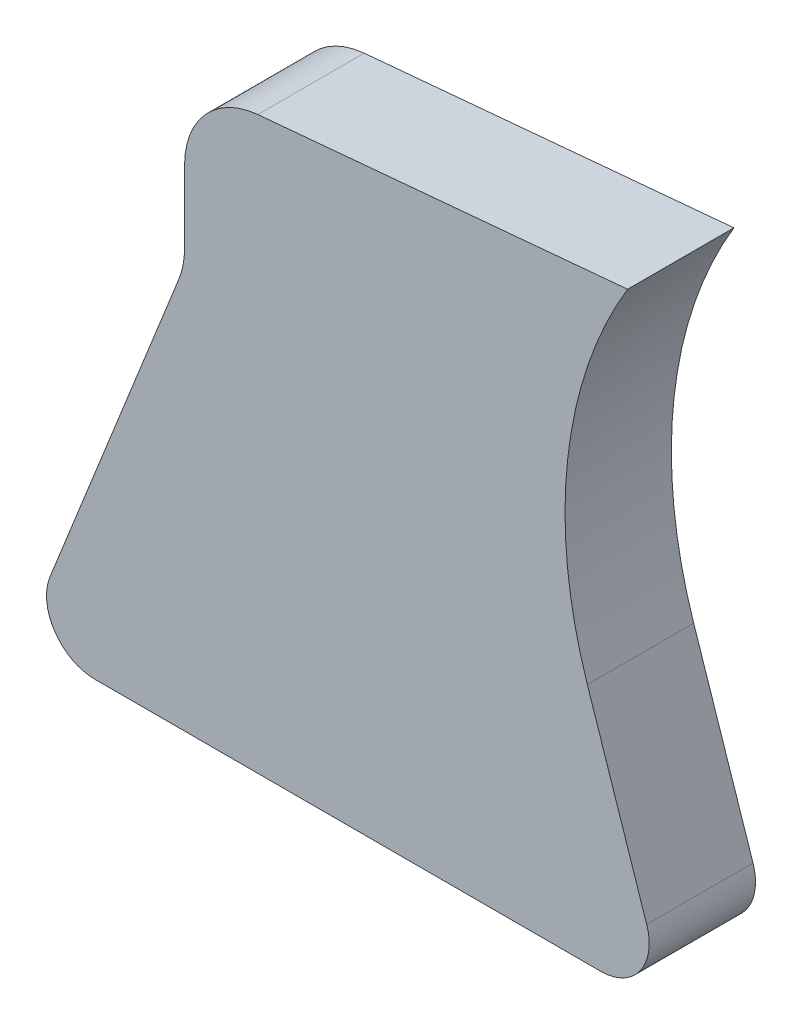
ISO-10303-21;
HEADER;
FILE_DESCRIPTION(('STEP AP214'),'2;1');
FILE_NAME('part.step','',(''),(''),'','','');
FILE_SCHEMA(('AUTOMOTIVE_DESIGN { 1 0 10303 214 1 1 1 1 }'));
ENDSEC;
DATA;
#1=APPLICATION_CONTEXT('core data for automotive mechanical design processes');
#2=APPLICATION_PROTOCOL_DEFINITION('international standard','automotive_design',2000,#1);
#3=PRODUCT_CONTEXT('',#1,'mechanical');
#4=PRODUCT('Part','Part','',(#3));
#5=PRODUCT_RELATED_PRODUCT_CATEGORY('part','',(#4));
#6=PRODUCT_DEFINITION_FORMATION('','',#4);
#7=PRODUCT_DEFINITION_CONTEXT('part definition',#1,'design');
#8=PRODUCT_DEFINITION('design','',#6,#7);
#9=PRODUCT_DEFINITION_SHAPE('','',#8);
#10=(LENGTH_UNIT() NAMED_UNIT(*) SI_UNIT(.MILLI.,.METRE.));
#11=(NAMED_UNIT(*) PLANE_ANGLE_UNIT() SI_UNIT($,.RADIAN.));
#12=(NAMED_UNIT(*) SI_UNIT($,.STERADIAN.) SOLID_ANGLE_UNIT());
#13=UNCERTAINTY_MEASURE_WITH_UNIT(LENGTH_MEASURE(1.E-05),#10,'distance_accuracy_value','');
#14=(GEOMETRIC_REPRESENTATION_CONTEXT(3) GLOBAL_UNCERTAINTY_ASSIGNED_CONTEXT((#13)) GLOBAL_UNIT_ASSIGNED_CONTEXT((#10,
#11,#12)) REPRESENTATION_CONTEXT('',''));
#15=CARTESIAN_POINT('',(0.,0.,0.));
#16=DIRECTION('',(0.,0.,1.));
#17=DIRECTION('',(1.,0.,0.));
#18=AXIS2_PLACEMENT_3D('',#15,#16,#17);
#19=CARTESIAN_POINT('',(50.8,0.,8.382));
#20=DIRECTION('',(0.,1.,0.));
#21=DIRECTION('',(-1.,0.,0.));
#22=AXIS2_PLACEMENT_3D('',#19,#20,#21);
#23=PLANE('',#22);
#24=DIRECTION('',(1.,0.,0.));
#25=VECTOR('',#24,1.);
#26=CARTESIAN_POINT('',(50.8,0.,0.));
#27=LINE('',#26,#25);
#28=CARTESIAN_POINT('',(5.6274955830365,0.,0.));
#29=VERTEX_POINT('',#28);
#30=CARTESIAN_POINT('',(45.5139073715862,0.,0.));
#31=VERTEX_POINT('',#30);
#32=EDGE_CURVE('E147',#29,#31,#27,.T.);
#33=ORIENTED_EDGE('',*,*,#32,.T.);
#34=DIRECTION('',(0.,0.,-1.));
#35=VECTOR('',#34,1.);
#36=CARTESIAN_POINT('',(45.5139073715862,0.,8.382));
#37=LINE('',#36,#35);
#38=CARTESIAN_POINT('',(45.5139073715862,0.,8.382));
#39=VERTEX_POINT('',#38);
#40=EDGE_CURVE('E54',#31,#39,#37,.F.);
#41=ORIENTED_EDGE('',*,*,#40,.T.);
#42=DIRECTION('',(1.,0.,0.));
#43=VECTOR('',#42,1.);
#44=CARTESIAN_POINT('',(50.8,0.,8.382));
#45=LINE('',#44,#43);
#46=CARTESIAN_POINT('',(5.6274955830365,0.,8.382));
#47=VERTEX_POINT('',#46);
#48=EDGE_CURVE('E122',#47,#39,#45,.T.);
#49=ORIENTED_EDGE('',*,*,#48,.F.);
#50=DIRECTION('',(0.,0.,-1.));
#51=VECTOR('',#50,1.);
#52=CARTESIAN_POINT('',(5.6274955830365,0.,8.382));
#53=LINE('',#52,#51);
#54=EDGE_CURVE('E184',#47,#29,#53,.T.);
#55=ORIENTED_EDGE('',*,*,#54,.T.);
#56=EDGE_LOOP('',(#33,#41,#49,#55));
#57=FACE_BOUND('',#56,.T.);
#58=ADVANCED_FACE('F33',(#57),#23,.F.);
#59=CARTESIAN_POINT('',(44.45,19.05,8.382));
#60=DIRECTION('',(-0.948683298050514,-0.316227766016838,0.));
#61=DIRECTION('',(0.316227766016838,-0.948683298050514,0.));
#62=AXIS2_PLACEMENT_3D('',#59,#60,#61);
#63=PLANE('',#62);
#64=DIRECTION('',(-0.316227766016838,0.948683298050514,0.));
#65=VECTOR('',#64,1.);
#66=CARTESIAN_POINT('',(44.45,19.05,8.382));
#67=LINE('',#66,#65);
#68=CARTESIAN_POINT('',(49.1283907371586,5.01482778852415,8.382));
#69=VERTEX_POINT('',#68);
#70=CARTESIAN_POINT('',(44.45,19.05,8.382));
#71=VERTEX_POINT('',#70);
#72=EDGE_CURVE('E111',#69,#71,#67,.T.);
#73=ORIENTED_EDGE('',*,*,#72,.F.);
#74=DIRECTION('',(0.,0.,-1.));
#75=VECTOR('',#74,1.);
#76=CARTESIAN_POINT('',(49.1283907371586,5.01482778852415,8.382));
#77=LINE('',#76,#75);
#78=CARTESIAN_POINT('',(49.1283907371586,5.01482778852415,0.));
#79=VERTEX_POINT('',#78);
#80=EDGE_CURVE('E178',#69,#79,#77,.T.);
#81=ORIENTED_EDGE('',*,*,#80,.T.);
#82=DIRECTION('',(-0.316227766016838,0.948683298050514,0.));
#83=VECTOR('',#82,1.);
#84=CARTESIAN_POINT('',(44.45,19.05,0.));
#85=LINE('',#84,#83);
#86=CARTESIAN_POINT('',(44.45,19.05,0.));
#87=VERTEX_POINT('',#86);
#88=EDGE_CURVE('E128',#79,#87,#85,.T.);
#89=ORIENTED_EDGE('',*,*,#88,.T.);
#90=DIRECTION('',(0.,0.,-1.));
#91=VECTOR('',#90,1.);
#92=CARTESIAN_POINT('',(44.45,19.05,8.382));
#93=LINE('',#92,#91);
#94=EDGE_CURVE('E125',#71,#87,#93,.T.);
#95=ORIENTED_EDGE('',*,*,#94,.F.);
#96=EDGE_LOOP('',(#73,#81,#89,#95));
#97=FACE_BOUND('',#96,.T.);
#98=ADVANCED_FACE('F126',(#97),#63,.F.);
#99=CARTESIAN_POINT('',(76.99375,29.8979166666667,8.382));
#100=DIRECTION('',(0.,0.,-1.));
#101=DIRECTION('',(-1.,0.,0.));
#102=AXIS2_PLACEMENT_3D('',#99,#100,#101);
#103=CYLINDRICAL_SURFACE('',#102,34.3041245343682);
#104=CARTESIAN_POINT('',(76.99375,29.8979166666667,0.));
#105=DIRECTION('',(0.,0.,-1.));
#106=DIRECTION('',(1.,0.,0.));
#107=AXIS2_PLACEMENT_3D('',#104,#105,#106);
#108=CIRCLE('',#107,34.3041245343682);
#109=CARTESIAN_POINT('',(47.625,47.625,0.));
#110=VERTEX_POINT('',#109);
#111=EDGE_CURVE('E150',#87,#110,#108,.T.);
#112=ORIENTED_EDGE('',*,*,#111,.T.);
#113=DIRECTION('',(0.,0.,-1.));
#114=VECTOR('',#113,1.);
#115=CARTESIAN_POINT('',(47.625,47.625,8.382));
#116=LINE('',#115,#114);
#117=CARTESIAN_POINT('',(47.625,47.625,8.382));
#118=VERTEX_POINT('',#117);
#119=EDGE_CURVE('E132',#118,#110,#116,.T.);
#120=ORIENTED_EDGE('',*,*,#119,.F.);
#121=CARTESIAN_POINT('',(76.99375,29.8979166666667,8.382));
#122=DIRECTION('',(0.,0.,-1.));
#123=DIRECTION('',(1.,0.,0.));
#124=AXIS2_PLACEMENT_3D('',#121,#122,#123);
#125=CIRCLE('',#124,34.3041245343682);
#126=EDGE_CURVE('E116',#71,#118,#125,.T.);
#127=ORIENTED_EDGE('',*,*,#126,.F.);
#128=ORIENTED_EDGE('',*,*,#94,.T.);
#129=EDGE_LOOP('',(#112,#120,#127,#128));
#130=FACE_BOUND('',#129,.T.);
#131=ADVANCED_FACE('F134',(#130),#103,.F.);
#132=CARTESIAN_POINT('',(12.7,44.45,8.382));
#133=DIRECTION('',(0.0905357460425185,-0.995893206467704,0.));
#134=DIRECTION('',(0.995893206467704,0.0905357460425185,0.));
#135=AXIS2_PLACEMENT_3D('',#132,#133,#134);
#136=PLANE('',#135);
#137=DIRECTION('',(-0.995893206467704,-0.0905357460425185,0.));
#138=VECTOR('',#137,1.);
#139=CARTESIAN_POINT('',(12.7,44.45,0.));
#140=LINE('',#139,#138);
#141=CARTESIAN_POINT('',(18.47509801263,44.9750089102391,0.));
#142=VERTEX_POINT('',#141);
#143=EDGE_CURVE('E152',#110,#142,#140,.T.);
#144=ORIENTED_EDGE('',*,*,#143,.T.);
#145=DIRECTION('',(0.,0.,-1.));
#146=VECTOR('',#145,1.);
#147=CARTESIAN_POINT('',(18.47509801263,44.9750089102391,8.382));
#148=LINE('',#147,#146);
#149=CARTESIAN_POINT('',(18.47509801263,44.9750089102391,8.382));
#150=VERTEX_POINT('',#149);
#151=EDGE_CURVE('E167',#142,#150,#148,.F.);
#152=ORIENTED_EDGE('',*,*,#151,.T.);
#153=DIRECTION('',(-0.995893206467704,-0.0905357460425185,0.));
#154=VECTOR('',#153,1.);
#155=CARTESIAN_POINT('',(12.7,44.45,8.382));
#156=LINE('',#155,#154);
#157=EDGE_CURVE('E137',#118,#150,#156,.T.);
#158=ORIENTED_EDGE('',*,*,#157,.F.);
#159=ORIENTED_EDGE('',*,*,#119,.T.);
#160=EDGE_LOOP('',(#144,#152,#158,#159));
#161=FACE_BOUND('',#160,.T.);
#162=ADVANCED_FACE('F213',(#161),#136,.F.);
#163=CARTESIAN_POINT('',(12.7,31.75,8.382));
#164=DIRECTION('',(1.,0.,0.));
#165=DIRECTION('',(0.,0.,-1.));
#166=AXIS2_PLACEMENT_3D('',#163,#164,#165);
#167=PLANE('',#166);
#168=DIRECTION('',(0.,-1.,0.));
#169=VECTOR('',#168,1.);
#170=CARTESIAN_POINT('',(12.7,31.75,8.382));
#171=LINE('',#170,#169);
#172=CARTESIAN_POINT('',(12.7,38.6510870491692,8.382));
#173=VERTEX_POINT('',#172);
#174=CARTESIAN_POINT('',(12.7,32.9728982626521,8.382));
#175=VERTEX_POINT('',#174);
#176=EDGE_CURVE('E139',#173,#175,#171,.T.);
#177=ORIENTED_EDGE('',*,*,#176,.F.);
#178=DIRECTION('',(0.,0.,-1.));
#179=VECTOR('',#178,1.);
#180=CARTESIAN_POINT('',(12.7,38.6510870491692,8.382));
#181=LINE('',#180,#179);
#182=CARTESIAN_POINT('',(12.7,38.6510870491692,0.));
#183=VERTEX_POINT('',#182);
#184=EDGE_CURVE('E162',#173,#183,#181,.T.);
#185=ORIENTED_EDGE('',*,*,#184,.T.);
#186=DIRECTION('',(0.,-1.,0.));
#187=VECTOR('',#186,1.);
#188=CARTESIAN_POINT('',(12.7,31.75,0.));
#189=LINE('',#188,#187);
#190=CARTESIAN_POINT('',(12.7,32.9728982626521,0.));
#191=VERTEX_POINT('',#190);
#192=EDGE_CURVE('E155',#183,#191,#189,.T.);
#193=ORIENTED_EDGE('',*,*,#192,.T.);
#194=DIRECTION('',(0.,0.,-1.));
#195=VECTOR('',#194,1.);
#196=CARTESIAN_POINT('',(12.7,32.9728982626521,8.382));
#197=LINE('',#196,#195);
#198=EDGE_CURVE('E131',#191,#175,#197,.F.);
#199=ORIENTED_EDGE('',*,*,#198,.T.);
#200=EDGE_LOOP('',(#177,#185,#193,#199));
#201=FACE_BOUND('',#200,.T.);
#202=ADVANCED_FACE('F205',(#201),#167,.F.);
#203=CARTESIAN_POINT('',(0.,0.,8.382));
#204=DIRECTION('',(0.928476690885259,-0.371390676354104,0.));
#205=DIRECTION('',(0.371390676354104,0.92847669088526,0.));
#206=AXIS2_PLACEMENT_3D('',#203,#204,#205);
#207=PLANE('',#206);
#208=DIRECTION('',(-0.371390676354104,-0.928476690885259,0.));
#209=VECTOR('',#208,1.);
#210=CARTESIAN_POINT('',(0.,0.,0.));
#211=LINE('',#210,#209);
#212=CARTESIAN_POINT('',(12.2458269871214,30.6145674678035,0.));
#213=VERTEX_POINT('',#212);
#214=CARTESIAN_POINT('',(2.08999939076365,5.22499847690914,0.));
#215=VERTEX_POINT('',#214);
#216=EDGE_CURVE('E158',#213,#215,#211,.T.);
#217=ORIENTED_EDGE('',*,*,#216,.T.);
#218=DIRECTION('',(0.,0.,-1.));
#219=VECTOR('',#218,1.);
#220=CARTESIAN_POINT('',(2.08999939076365,5.22499847690914,8.382));
#221=LINE('',#220,#219);
#222=CARTESIAN_POINT('',(2.08999939076365,5.22499847690914,8.382));
#223=VERTEX_POINT('',#222);
#224=EDGE_CURVE('E11',#215,#223,#221,.F.);
#225=ORIENTED_EDGE('',*,*,#224,.T.);
#226=DIRECTION('',(-0.371390676354104,-0.928476690885259,0.));
#227=VECTOR('',#226,1.);
#228=CARTESIAN_POINT('',(0.,0.,8.382));
#229=LINE('',#228,#227);
#230=CARTESIAN_POINT('',(12.2458269871214,30.6145674678035,8.382));
#231=VERTEX_POINT('',#230);
#232=EDGE_CURVE('E145',#231,#223,#229,.T.);
#233=ORIENTED_EDGE('',*,*,#232,.F.);
#234=DIRECTION('',(0.,0.,-1.));
#235=VECTOR('',#234,1.);
#236=CARTESIAN_POINT('',(12.2458269871214,30.6145674678035,0.));
#237=LINE('',#236,#235);
#238=EDGE_CURVE('E171',#231,#213,#237,.T.);
#239=ORIENTED_EDGE('',*,*,#238,.T.);
#240=EDGE_LOOP('',(#217,#225,#233,#239));
#241=FACE_BOUND('',#240,.T.);
#242=ADVANCED_FACE('F196',(#241),#207,.F.);
#243=CARTESIAN_POINT('',(76.99375,29.8979166666667,8.382));
#244=DIRECTION('',(0.,0.,1.));
#245=DIRECTION('',(1.,0.,0.));
#246=AXIS2_PLACEMENT_3D('',#243,#244,#245);
#247=PLANE('',#246);
#248=ORIENTED_EDGE('',*,*,#48,.T.);
#249=CARTESIAN_POINT('',(45.5139073715862,3.81,8.382));
#250=DIRECTION('',(0.,0.,1.));
#251=DIRECTION('',(1.,0.,0.));
#252=AXIS2_PLACEMENT_3D('',#249,#250,#251);
#253=CIRCLE('',#252,3.81);
#254=EDGE_CURVE('E41',#39,#69,#253,.T.);
#255=ORIENTED_EDGE('',*,*,#254,.T.);
#256=ORIENTED_EDGE('',*,*,#72,.T.);
#257=ORIENTED_EDGE('',*,*,#126,.T.);
#258=ORIENTED_EDGE('',*,*,#157,.T.);
#259=CARTESIAN_POINT('',(19.05,38.6510870491692,8.382));
#260=DIRECTION('',(0.,0.,1.));
#261=DIRECTION('',(1.,0.,0.));
#262=AXIS2_PLACEMENT_3D('',#259,#260,#261);
#263=CIRCLE('',#262,6.35);
#264=EDGE_CURVE('E169',#150,#173,#263,.T.);
#265=ORIENTED_EDGE('',*,*,#264,.T.);
#266=ORIENTED_EDGE('',*,*,#176,.T.);
#267=CARTESIAN_POINT('',(6.35,32.9728982626521,8.382));
#268=DIRECTION('',(0.,0.,1.));
#269=DIRECTION('',(1.,0.,0.));
#270=AXIS2_PLACEMENT_3D('',#267,#268,#269);
#271=CIRCLE('',#270,6.35);
#272=EDGE_CURVE('E176',#175,#231,#271,.F.);
#273=ORIENTED_EDGE('',*,*,#272,.T.);
#274=ORIENTED_EDGE('',*,*,#232,.T.);
#275=CARTESIAN_POINT('',(5.6274955830365,3.81,8.382));
#276=DIRECTION('',(0.,0.,1.));
#277=DIRECTION('',(1.,0.,0.));
#278=AXIS2_PLACEMENT_3D('',#275,#276,#277);
#279=CIRCLE('',#278,3.81);
#280=EDGE_CURVE('E188',#223,#47,#279,.T.);
#281=ORIENTED_EDGE('',*,*,#280,.T.);
#282=EDGE_LOOP('',(#248,#255,#256,#257,#258,#265,#266,#273,#274,#281));
#283=FACE_BOUND('',#282,.T.);
#284=ADVANCED_FACE('F113',(#283),#247,.T.);
#285=CARTESIAN_POINT('',(76.99375,29.8979166666667,0.));
#286=DIRECTION('',(0.,0.,1.));
#287=DIRECTION('',(1.,0.,0.));
#288=AXIS2_PLACEMENT_3D('',#285,#286,#287);
#289=PLANE('',#288);
#290=ORIENTED_EDGE('',*,*,#88,.F.);
#291=CARTESIAN_POINT('',(45.5139073715862,3.81,0.));
#292=DIRECTION('',(0.,0.,1.));
#293=DIRECTION('',(1.,0.,0.));
#294=AXIS2_PLACEMENT_3D('',#291,#292,#293);
#295=CIRCLE('',#294,3.81);
#296=EDGE_CURVE('E182',#79,#31,#295,.F.);
#297=ORIENTED_EDGE('',*,*,#296,.T.);
#298=ORIENTED_EDGE('',*,*,#32,.F.);
#299=CARTESIAN_POINT('',(5.6274955830365,3.81,0.));
#300=DIRECTION('',(0.,0.,1.));
#301=DIRECTION('',(1.,0.,0.));
#302=AXIS2_PLACEMENT_3D('',#299,#300,#301);
#303=CIRCLE('',#302,3.81);
#304=EDGE_CURVE('E180',#29,#215,#303,.F.);
#305=ORIENTED_EDGE('',*,*,#304,.T.);
#306=ORIENTED_EDGE('',*,*,#216,.F.);
#307=CARTESIAN_POINT('',(6.35,32.9728982626521,0.));
#308=DIRECTION('',(0.,0.,1.));
#309=DIRECTION('',(1.,0.,0.));
#310=AXIS2_PLACEMENT_3D('',#307,#308,#309);
#311=CIRCLE('',#310,6.35);
#312=EDGE_CURVE('E174',#213,#191,#311,.T.);
#313=ORIENTED_EDGE('',*,*,#312,.T.);
#314=ORIENTED_EDGE('',*,*,#192,.F.);
#315=CARTESIAN_POINT('',(19.05,38.6510870491692,0.));
#316=DIRECTION('',(0.,0.,1.));
#317=DIRECTION('',(1.,0.,0.));
#318=AXIS2_PLACEMENT_3D('',#315,#316,#317);
#319=CIRCLE('',#318,6.35);
#320=EDGE_CURVE('E165',#183,#142,#319,.F.);
#321=ORIENTED_EDGE('',*,*,#320,.T.);
#322=ORIENTED_EDGE('',*,*,#143,.F.);
#323=ORIENTED_EDGE('',*,*,#111,.F.);
#324=EDGE_LOOP('',(#290,#297,#298,#305,#306,#313,#314,#321,#322,#323));
#325=FACE_BOUND('',#324,.T.);
#326=ADVANCED_FACE('F195',(#325),#289,.F.);
#327=CARTESIAN_POINT('',(19.05,38.6510870491692,8.382));
#328=DIRECTION('',(0.,0.,-1.));
#329=DIRECTION('',(-1.,0.,0.));
#330=AXIS2_PLACEMENT_3D('',#327,#328,#329);
#331=CYLINDRICAL_SURFACE('',#330,6.35);
#332=ORIENTED_EDGE('',*,*,#264,.F.);
#333=ORIENTED_EDGE('',*,*,#151,.F.);
#334=ORIENTED_EDGE('',*,*,#320,.F.);
#335=ORIENTED_EDGE('',*,*,#184,.F.);
#336=EDGE_LOOP('',(#332,#333,#334,#335));
#337=FACE_BOUND('',#336,.T.);
#338=ADVANCED_FACE('F209',(#337),#331,.T.);
#339=CARTESIAN_POINT('',(6.35,32.9728982626521,8.382));
#340=DIRECTION('',(0.,0.,1.));
#341=DIRECTION('',(1.,0.,0.));
#342=AXIS2_PLACEMENT_3D('',#339,#340,#341);
#343=CYLINDRICAL_SURFACE('',#342,6.35);
#344=ORIENTED_EDGE('',*,*,#272,.F.);
#345=ORIENTED_EDGE('',*,*,#198,.F.);
#346=ORIENTED_EDGE('',*,*,#312,.F.);
#347=ORIENTED_EDGE('',*,*,#238,.F.);
#348=EDGE_LOOP('',(#344,#345,#346,#347));
#349=FACE_BOUND('',#348,.T.);
#350=ADVANCED_FACE('F200',(#349),#343,.F.);
#351=CARTESIAN_POINT('',(45.5139073715862,3.81,8.382));
#352=DIRECTION('',(0.,0.,-1.));
#353=DIRECTION('',(-1.,0.,0.));
#354=AXIS2_PLACEMENT_3D('',#351,#352,#353);
#355=CYLINDRICAL_SURFACE('',#354,3.81);
#356=ORIENTED_EDGE('',*,*,#254,.F.);
#357=ORIENTED_EDGE('',*,*,#40,.F.);
#358=ORIENTED_EDGE('',*,*,#296,.F.);
#359=ORIENTED_EDGE('',*,*,#80,.F.);
#360=EDGE_LOOP('',(#356,#357,#358,#359));
#361=FACE_BOUND('',#360,.T.);
#362=ADVANCED_FACE('F232',(#361),#355,.T.);
#363=CARTESIAN_POINT('',(5.6274955830365,3.81,8.382));
#364=DIRECTION('',(0.,0.,-1.));
#365=DIRECTION('',(-1.,0.,0.));
#366=AXIS2_PLACEMENT_3D('',#363,#364,#365);
#367=CYLINDRICAL_SURFACE('',#366,3.81);
#368=ORIENTED_EDGE('',*,*,#280,.F.);
#369=ORIENTED_EDGE('',*,*,#224,.F.);
#370=ORIENTED_EDGE('',*,*,#304,.F.);
#371=ORIENTED_EDGE('',*,*,#54,.F.);
#372=EDGE_LOOP('',(#368,#369,#370,#371));
#373=FACE_BOUND('',#372,.T.);
#374=ADVANCED_FACE('F35',(#373),#367,.T.);
#375=CLOSED_SHELL('',(#58,#98,#131,#162,#202,#242,#284,#326,#338,#350,#362,#374));
#376=MANIFOLD_SOLID_BREP('B2',#375);
#377=ADVANCED_BREP_SHAPE_REPRESENTATION('',(#18,#376),#14);
#378=SHAPE_DEFINITION_REPRESENTATION(#9,#377);
ENDSEC;
END-ISO-10303-21;
